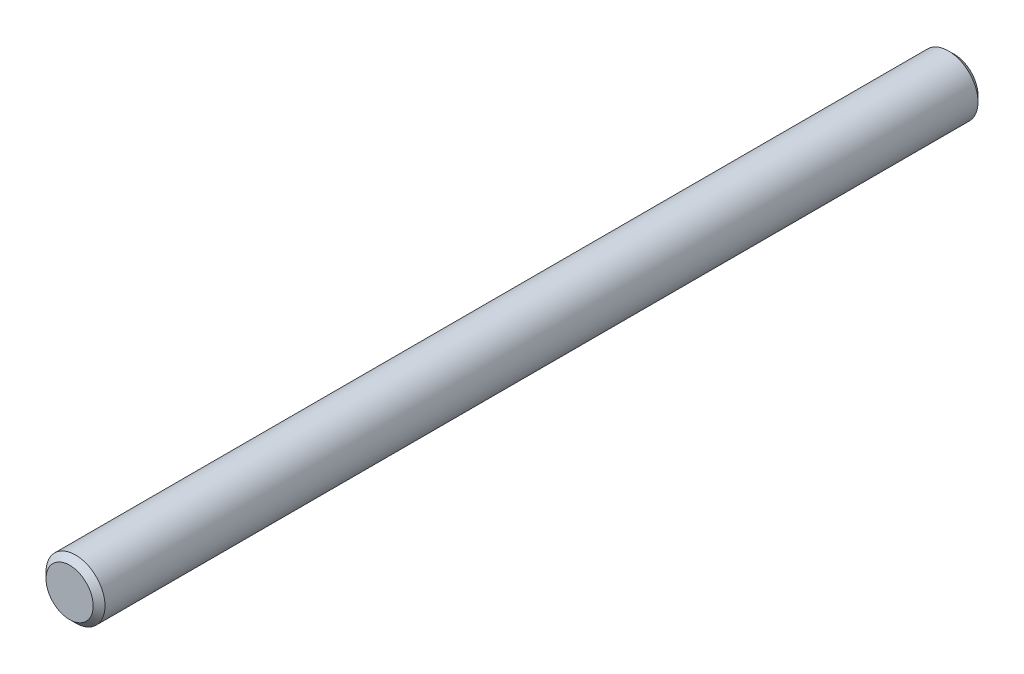
ISO-10303-21;
HEADER;
FILE_DESCRIPTION(('STEP AP214'),'2;1');
FILE_NAME('part.step','',(''),(''),'','','');
FILE_SCHEMA(('AUTOMOTIVE_DESIGN { 1 0 10303 214 1 1 1 1 }'));
ENDSEC;
DATA;
#1=APPLICATION_CONTEXT('core data for automotive mechanical design processes');
#2=APPLICATION_PROTOCOL_DEFINITION('international standard','automotive_design',2000,#1);
#3=PRODUCT_CONTEXT('',#1,'mechanical');
#4=PRODUCT('Part','Part','',(#3));
#5=PRODUCT_RELATED_PRODUCT_CATEGORY('part','',(#4));
#6=PRODUCT_DEFINITION_FORMATION('','',#4);
#7=PRODUCT_DEFINITION_CONTEXT('part definition',#1,'design');
#8=PRODUCT_DEFINITION('design','',#6,#7);
#9=PRODUCT_DEFINITION_SHAPE('','',#8);
#10=(LENGTH_UNIT() NAMED_UNIT(*) SI_UNIT(.MILLI.,.METRE.));
#11=(NAMED_UNIT(*) PLANE_ANGLE_UNIT() SI_UNIT($,.RADIAN.));
#12=(NAMED_UNIT(*) SI_UNIT($,.STERADIAN.) SOLID_ANGLE_UNIT());
#13=UNCERTAINTY_MEASURE_WITH_UNIT(LENGTH_MEASURE(1.E-05),#10,'distance_accuracy_value','');
#14=(GEOMETRIC_REPRESENTATION_CONTEXT(3) GLOBAL_UNCERTAINTY_ASSIGNED_CONTEXT((#13)) GLOBAL_UNIT_ASSIGNED_CONTEXT((#10,
#11,#12)) REPRESENTATION_CONTEXT('',''));
#15=CARTESIAN_POINT('',(0.,0.,0.));
#16=DIRECTION('',(0.,0.,1.));
#17=DIRECTION('',(1.,0.,0.));
#18=AXIS2_PLACEMENT_3D('',#15,#16,#17);
#19=CARTESIAN_POINT('',(0.,0.,75.));
#20=DIRECTION('',(0.,0.,-1.));
#21=DIRECTION('',(-1.,0.,0.));
#22=AXIS2_PLACEMENT_3D('',#19,#20,#21);
#23=CYLINDRICAL_SURFACE('',#22,2.5);
#24=CARTESIAN_POINT('',(0.,0.,0.5));
#25=DIRECTION('',(0.,0.,1.));
#26=DIRECTION('',(1.,0.,0.));
#27=AXIS2_PLACEMENT_3D('',#24,#25,#26);
#28=CIRCLE('',#27,2.5);
#29=CARTESIAN_POINT('',(2.5,0.,0.5));
#30=VERTEX_POINT('',#29);
#31=EDGE_CURVE('E41',#30,#30,#28,.T.);
#32=ORIENTED_EDGE('',*,*,#31,.T.);
#33=EDGE_LOOP('',(#32));
#34=FACE_BOUND('',#33,.T.);
#35=CARTESIAN_POINT('',(0.,0.,74.5));
#36=DIRECTION('',(0.,0.,1.));
#37=DIRECTION('',(1.,0.,0.));
#38=AXIS2_PLACEMENT_3D('',#35,#36,#37);
#39=CIRCLE('',#38,2.5);
#40=CARTESIAN_POINT('',(2.5,0.,74.5));
#41=VERTEX_POINT('',#40);
#42=EDGE_CURVE('E45',#41,#41,#39,.F.);
#43=ORIENTED_EDGE('',*,*,#42,.T.);
#44=EDGE_LOOP('',(#43));
#45=FACE_BOUND('',#44,.T.);
#46=ADVANCED_FACE('F30',(#34,#45),#23,.T.);
#47=CARTESIAN_POINT('',(0.,0.,75.));
#48=DIRECTION('',(0.,0.,1.));
#49=DIRECTION('',(1.,0.,0.));
#50=AXIS2_PLACEMENT_3D('',#47,#48,#49);
#51=PLANE('',#50);
#52=CARTESIAN_POINT('',(0.,0.,75.));
#53=DIRECTION('',(0.,0.,1.));
#54=DIRECTION('',(1.,0.,0.));
#55=AXIS2_PLACEMENT_3D('',#52,#53,#54);
#56=CIRCLE('',#55,2.);
#57=CARTESIAN_POINT('',(2.,0.,75.));
#58=VERTEX_POINT('',#57);
#59=EDGE_CURVE('E10',#58,#58,#56,.T.);
#60=ORIENTED_EDGE('',*,*,#59,.T.);
#61=EDGE_LOOP('',(#60));
#62=FACE_BOUND('',#61,.T.);
#63=ADVANCED_FACE('F61',(#62),#51,.T.);
#64=CARTESIAN_POINT('',(0.,0.,0.));
#65=DIRECTION('',(0.,0.,1.));
#66=DIRECTION('',(1.,0.,0.));
#67=AXIS2_PLACEMENT_3D('',#64,#65,#66);
#68=PLANE('',#67);
#69=CARTESIAN_POINT('',(0.,0.,0.));
#70=DIRECTION('',(0.,0.,1.));
#71=DIRECTION('',(1.,0.,0.));
#72=AXIS2_PLACEMENT_3D('',#69,#70,#71);
#73=CIRCLE('',#72,1.99999999999999);
#74=CARTESIAN_POINT('',(1.99999999999999,0.,0.));
#75=VERTEX_POINT('',#74);
#76=EDGE_CURVE('E37',#75,#75,#73,.F.);
#77=ORIENTED_EDGE('',*,*,#76,.T.);
#78=EDGE_LOOP('',(#77));
#79=FACE_BOUND('',#78,.T.);
#80=ADVANCED_FACE('F58',(#79),#68,.F.);
#81=CARTESIAN_POINT('',(0.,0.,0.5));
#82=DIRECTION('',(0.,0.,1.));
#83=DIRECTION('',(1.,0.,0.));
#84=AXIS2_PLACEMENT_3D('',#81,#82,#83);
#85=CONICAL_SURFACE('',#84,2.5,0.785398163397453);
#86=ORIENTED_EDGE('',*,*,#76,.F.);
#87=EDGE_LOOP('',(#86));
#88=FACE_BOUND('',#87,.T.);
#89=ORIENTED_EDGE('',*,*,#31,.F.);
#90=EDGE_LOOP('',(#89));
#91=FACE_BOUND('',#90,.T.);
#92=ADVANCED_FACE('F54',(#88,#91),#85,.T.);
#93=CARTESIAN_POINT('',(0.,0.,75.));
#94=DIRECTION('',(0.,0.,-1.));
#95=DIRECTION('',(-1.,0.,0.));
#96=AXIS2_PLACEMENT_3D('',#93,#94,#95);
#97=CONICAL_SURFACE('',#96,2.,0.78539816339746);
#98=ORIENTED_EDGE('',*,*,#42,.F.);
#99=EDGE_LOOP('',(#98));
#100=FACE_BOUND('',#99,.T.);
#101=ORIENTED_EDGE('',*,*,#59,.F.);
#102=EDGE_LOOP('',(#101));
#103=FACE_BOUND('',#102,.T.);
#104=ADVANCED_FACE('F32',(#100,#103),#97,.T.);
#105=CLOSED_SHELL('',(#46,#63,#80,#92,#104));
#106=MANIFOLD_SOLID_BREP('B2',#105);
#107=ADVANCED_BREP_SHAPE_REPRESENTATION('',(#18,#106),#14);
#108=SHAPE_DEFINITION_REPRESENTATION(#9,#107);
ENDSEC;
END-ISO-10303-21;
